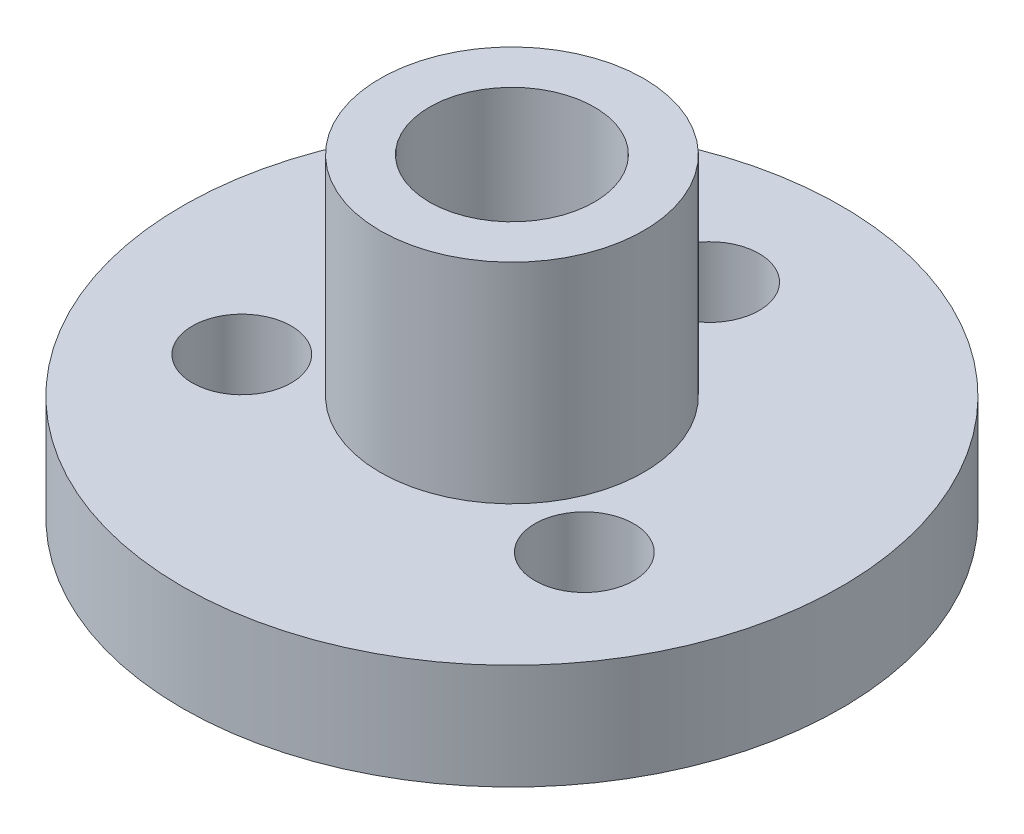
ISO-10303-21;
HEADER;
FILE_DESCRIPTION(('STEP AP214'),'2;1');
FILE_NAME('part.step','',(''),(''),'','','');
FILE_SCHEMA(('AUTOMOTIVE_DESIGN { 1 0 10303 214 1 1 1 1 }'));
ENDSEC;
DATA;
#1=APPLICATION_CONTEXT('core data for automotive mechanical design processes');
#2=APPLICATION_PROTOCOL_DEFINITION('international standard','automotive_design',2000,#1);
#3=PRODUCT_CONTEXT('',#1,'mechanical');
#4=PRODUCT('Part','Part','',(#3));
#5=PRODUCT_RELATED_PRODUCT_CATEGORY('part','',(#4));
#6=PRODUCT_DEFINITION_FORMATION('','',#4);
#7=PRODUCT_DEFINITION_CONTEXT('part definition',#1,'design');
#8=PRODUCT_DEFINITION('design','',#6,#7);
#9=PRODUCT_DEFINITION_SHAPE('','',#8);
#10=(LENGTH_UNIT() NAMED_UNIT(*) SI_UNIT(.MILLI.,.METRE.));
#11=(NAMED_UNIT(*) PLANE_ANGLE_UNIT() SI_UNIT($,.RADIAN.));
#12=(NAMED_UNIT(*) SI_UNIT($,.STERADIAN.) SOLID_ANGLE_UNIT());
#13=UNCERTAINTY_MEASURE_WITH_UNIT(LENGTH_MEASURE(1.E-05),#10,'distance_accuracy_value','');
#14=(GEOMETRIC_REPRESENTATION_CONTEXT(3) GLOBAL_UNCERTAINTY_ASSIGNED_CONTEXT((#13)) GLOBAL_UNIT_ASSIGNED_CONTEXT((#10,
#11,#12)) REPRESENTATION_CONTEXT('',''));
#15=CARTESIAN_POINT('',(0.,0.,0.));
#16=DIRECTION('',(0.,0.,1.));
#17=DIRECTION('',(1.,0.,0.));
#18=AXIS2_PLACEMENT_3D('',#15,#16,#17);
#19=CARTESIAN_POINT('',(-4.,9.55,0.));
#20=DIRECTION('',(0.,1.,0.));
#21=DIRECTION('',(0.,0.,1.));
#22=AXIS2_PLACEMENT_3D('',#19,#20,#21);
#23=PLANE('',#22);
#24=CARTESIAN_POINT('',(0.,9.55,0.));
#25=DIRECTION('',(0.,1.,0.));
#26=DIRECTION('',(0.,0.,1.));
#27=AXIS2_PLACEMENT_3D('',#24,#25,#26);
#28=CIRCLE('',#27,4.);
#29=CARTESIAN_POINT('',(0.,9.55,4.));
#30=VERTEX_POINT('',#29);
#31=EDGE_CURVE('E56',#30,#30,#28,.T.);
#32=ORIENTED_EDGE('',*,*,#31,.T.);
#33=EDGE_LOOP('',(#32));
#34=FACE_BOUND('',#33,.T.);
#35=CARTESIAN_POINT('',(0.,9.55,0.));
#36=DIRECTION('',(0.,1.,0.));
#37=DIRECTION('',(0.,0.,1.));
#38=AXIS2_PLACEMENT_3D('',#35,#36,#37);
#39=CIRCLE('',#38,2.5);
#40=CARTESIAN_POINT('',(0.,9.55,2.5));
#41=VERTEX_POINT('',#40);
#42=EDGE_CURVE('E10',#41,#41,#39,.T.);
#43=ORIENTED_EDGE('',*,*,#42,.F.);
#44=EDGE_LOOP('',(#43));
#45=FACE_BOUND('',#44,.T.);
#46=ADVANCED_FACE('F34',(#34,#45),#23,.T.);
#47=CARTESIAN_POINT('',(0.,12.5097739938105,0.));
#48=DIRECTION('',(0.,1.,0.));
#49=DIRECTION('',(0.,0.,1.));
#50=AXIS2_PLACEMENT_3D('',#47,#48,#49);
#51=CYLINDRICAL_SURFACE('',#50,2.5);
#52=ORIENTED_EDGE('',*,*,#42,.T.);
#53=EDGE_LOOP('',(#52));
#54=FACE_BOUND('',#53,.T.);
#55=CARTESIAN_POINT('',(0.,0.,0.));
#56=DIRECTION('',(0.,1.,0.));
#57=DIRECTION('',(0.,0.,1.));
#58=AXIS2_PLACEMENT_3D('',#55,#56,#57);
#59=CIRCLE('',#58,2.5);
#60=CARTESIAN_POINT('',(0.,0.,2.5));
#61=VERTEX_POINT('',#60);
#62=EDGE_CURVE('E40',#61,#61,#59,.T.);
#63=ORIENTED_EDGE('',*,*,#62,.F.);
#64=EDGE_LOOP('',(#63));
#65=FACE_BOUND('',#64,.T.);
#66=ADVANCED_FACE('F110',(#54,#65),#51,.F.);
#67=CARTESIAN_POINT('',(-2.5,0.,0.));
#68=DIRECTION('',(0.,-1.,0.));
#69=DIRECTION('',(0.,0.,-1.));
#70=AXIS2_PLACEMENT_3D('',#67,#68,#69);
#71=PLANE('',#70);
#72=CARTESIAN_POINT('',(0.,0.,-6.));
#73=DIRECTION('',(0.,1.,0.));
#74=DIRECTION('',(0.,0.,1.));
#75=AXIS2_PLACEMENT_3D('',#72,#73,#74);
#76=CIRCLE('',#75,1.5);
#77=CARTESIAN_POINT('',(0.,0.,-4.5));
#78=VERTEX_POINT('',#77);
#79=EDGE_CURVE('E59',#78,#78,#76,.T.);
#80=ORIENTED_EDGE('',*,*,#79,.T.);
#81=EDGE_LOOP('',(#80));
#82=FACE_BOUND('',#81,.T.);
#83=CARTESIAN_POINT('',(5.19615242270663,0.,3.));
#84=DIRECTION('',(0.,1.,0.));
#85=DIRECTION('',(0.,0.,1.));
#86=AXIS2_PLACEMENT_3D('',#83,#84,#85);
#87=CIRCLE('',#86,1.5);
#88=CARTESIAN_POINT('',(5.19615242270663,0.,4.5));
#89=VERTEX_POINT('',#88);
#90=EDGE_CURVE('E69',#89,#89,#87,.T.);
#91=ORIENTED_EDGE('',*,*,#90,.T.);
#92=EDGE_LOOP('',(#91));
#93=FACE_BOUND('',#92,.T.);
#94=CARTESIAN_POINT('',(-5.19615242270663,0.,3.));
#95=DIRECTION('',(0.,1.,0.));
#96=DIRECTION('',(0.,0.,1.));
#97=AXIS2_PLACEMENT_3D('',#94,#95,#96);
#98=CIRCLE('',#97,1.5);
#99=CARTESIAN_POINT('',(-5.19615242270663,0.,4.5));
#100=VERTEX_POINT('',#99);
#101=EDGE_CURVE('E63',#100,#100,#98,.T.);
#102=ORIENTED_EDGE('',*,*,#101,.T.);
#103=EDGE_LOOP('',(#102));
#104=FACE_BOUND('',#103,.T.);
#105=ORIENTED_EDGE('',*,*,#62,.T.);
#106=EDGE_LOOP('',(#105));
#107=FACE_BOUND('',#106,.T.);
#108=CARTESIAN_POINT('',(0.,0.,0.));
#109=DIRECTION('',(0.,1.,0.));
#110=DIRECTION('',(0.,0.,1.));
#111=AXIS2_PLACEMENT_3D('',#108,#109,#110);
#112=CIRCLE('',#111,10.);
#113=CARTESIAN_POINT('',(0.,0.,10.));
#114=VERTEX_POINT('',#113);
#115=EDGE_CURVE('E44',#114,#114,#112,.T.);
#116=ORIENTED_EDGE('',*,*,#115,.F.);
#117=EDGE_LOOP('',(#116));
#118=FACE_BOUND('',#117,.T.);
#119=ADVANCED_FACE('F78',(#82,#93,#104,#107,#118),#71,.T.);
#120=CARTESIAN_POINT('',(0.,12.5097739938105,0.));
#121=DIRECTION('',(0.,1.,0.));
#122=DIRECTION('',(0.,0.,1.));
#123=AXIS2_PLACEMENT_3D('',#120,#121,#122);
#124=CYLINDRICAL_SURFACE('',#123,10.);
#125=ORIENTED_EDGE('',*,*,#115,.T.);
#126=EDGE_LOOP('',(#125));
#127=FACE_BOUND('',#126,.T.);
#128=CARTESIAN_POINT('',(0.,3.2,0.));
#129=DIRECTION('',(0.,1.,0.));
#130=DIRECTION('',(0.,0.,1.));
#131=AXIS2_PLACEMENT_3D('',#128,#129,#130);
#132=CIRCLE('',#131,10.);
#133=CARTESIAN_POINT('',(0.,3.2,10.));
#134=VERTEX_POINT('',#133);
#135=EDGE_CURVE('E48',#134,#134,#132,.T.);
#136=ORIENTED_EDGE('',*,*,#135,.F.);
#137=EDGE_LOOP('',(#136));
#138=FACE_BOUND('',#137,.T.);
#139=ADVANCED_FACE('F92',(#127,#138),#124,.T.);
#140=CARTESIAN_POINT('',(-10.,3.2,0.));
#141=DIRECTION('',(0.,1.,0.));
#142=DIRECTION('',(0.,0.,1.));
#143=AXIS2_PLACEMENT_3D('',#140,#141,#142);
#144=PLANE('',#143);
#145=CARTESIAN_POINT('',(0.,3.2,-6.));
#146=DIRECTION('',(0.,1.,0.));
#147=DIRECTION('',(0.,0.,1.));
#148=AXIS2_PLACEMENT_3D('',#145,#146,#147);
#149=CIRCLE('',#148,1.5);
#150=CARTESIAN_POINT('',(0.,3.2,-4.5));
#151=VERTEX_POINT('',#150);
#152=EDGE_CURVE('E72',#151,#151,#149,.T.);
#153=ORIENTED_EDGE('',*,*,#152,.F.);
#154=EDGE_LOOP('',(#153));
#155=FACE_BOUND('',#154,.T.);
#156=CARTESIAN_POINT('',(5.19615242270663,3.2,3.));
#157=DIRECTION('',(0.,1.,0.));
#158=DIRECTION('',(0.,0.,1.));
#159=AXIS2_PLACEMENT_3D('',#156,#157,#158);
#160=CIRCLE('',#159,1.5);
#161=CARTESIAN_POINT('',(5.19615242270663,3.2,4.5));
#162=VERTEX_POINT('',#161);
#163=EDGE_CURVE('E66',#162,#162,#160,.T.);
#164=ORIENTED_EDGE('',*,*,#163,.F.);
#165=EDGE_LOOP('',(#164));
#166=FACE_BOUND('',#165,.T.);
#167=CARTESIAN_POINT('',(-5.19615242270663,3.2,3.));
#168=DIRECTION('',(0.,1.,0.));
#169=DIRECTION('',(0.,0.,1.));
#170=AXIS2_PLACEMENT_3D('',#167,#168,#169);
#171=CIRCLE('',#170,1.5);
#172=CARTESIAN_POINT('',(-5.19615242270663,3.2,4.5));
#173=VERTEX_POINT('',#172);
#174=EDGE_CURVE('E60',#173,#173,#171,.T.);
#175=ORIENTED_EDGE('',*,*,#174,.F.);
#176=EDGE_LOOP('',(#175));
#177=FACE_BOUND('',#176,.T.);
#178=ORIENTED_EDGE('',*,*,#135,.T.);
#179=EDGE_LOOP('',(#178));
#180=FACE_BOUND('',#179,.T.);
#181=CARTESIAN_POINT('',(0.,3.2,0.));
#182=DIRECTION('',(0.,1.,0.));
#183=DIRECTION('',(0.,0.,1.));
#184=AXIS2_PLACEMENT_3D('',#181,#182,#183);
#185=CIRCLE('',#184,4.);
#186=CARTESIAN_POINT('',(0.,3.2,4.));
#187=VERTEX_POINT('',#186);
#188=EDGE_CURVE('E53',#187,#187,#185,.T.);
#189=ORIENTED_EDGE('',*,*,#188,.F.);
#190=EDGE_LOOP('',(#189));
#191=FACE_BOUND('',#190,.T.);
#192=ADVANCED_FACE('F88',(#155,#166,#177,#180,#191),#144,.T.);
#193=CARTESIAN_POINT('',(0.,12.5097739938105,0.));
#194=DIRECTION('',(0.,1.,0.));
#195=DIRECTION('',(0.,0.,1.));
#196=AXIS2_PLACEMENT_3D('',#193,#194,#195);
#197=CYLINDRICAL_SURFACE('',#196,4.);
#198=ORIENTED_EDGE('',*,*,#188,.T.);
#199=EDGE_LOOP('',(#198));
#200=FACE_BOUND('',#199,.T.);
#201=ORIENTED_EDGE('',*,*,#31,.F.);
#202=EDGE_LOOP('',(#201));
#203=FACE_BOUND('',#202,.T.);
#204=ADVANCED_FACE('F91',(#200,#203),#197,.T.);
#205=CARTESIAN_POINT('',(-5.19615242270663,0.,3.));
#206=DIRECTION('',(0.,1.,0.));
#207=DIRECTION('',(0.,0.,1.));
#208=AXIS2_PLACEMENT_3D('',#205,#206,#207);
#209=CYLINDRICAL_SURFACE('',#208,1.5);
#210=CARTESIAN_POINT('',(-5.19615242270663,0.,4.5));
#211=CARTESIAN_POINT('',(-5.19615242270663,0.0333333333333333,4.5));
#212=CARTESIAN_POINT('',(-5.19615242270663,0.0666666666666666,4.5));
#213=CARTESIAN_POINT('',(-5.19615242270663,0.133333333333333,4.5));
#214=CARTESIAN_POINT('',(-5.19615242270663,0.166666666666667,4.5));
#215=CARTESIAN_POINT('',(-5.19615242270663,0.233333333333333,4.5));
#216=CARTESIAN_POINT('',(-5.19615242270663,0.266666666666667,4.5));
#217=CARTESIAN_POINT('',(-5.19615242270663,0.333333333333333,4.5));
#218=CARTESIAN_POINT('',(-5.19615242270663,0.366666666666667,4.5));
#219=CARTESIAN_POINT('',(-5.19615242270663,0.433333333333333,4.5));
#220=CARTESIAN_POINT('',(-5.19615242270663,0.466666666666667,4.5));
#221=CARTESIAN_POINT('',(-5.19615242270663,0.533333333333333,4.5));
#222=CARTESIAN_POINT('',(-5.19615242270663,0.566666666666667,4.5));
#223=CARTESIAN_POINT('',(-5.19615242270663,0.633333333333333,4.5));
#224=CARTESIAN_POINT('',(-5.19615242270663,0.666666666666666,4.5));
#225=CARTESIAN_POINT('',(-5.19615242270663,0.733333333333333,4.5));
#226=CARTESIAN_POINT('',(-5.19615242270663,0.766666666666666,4.5));
#227=CARTESIAN_POINT('',(-5.19615242270663,0.833333333333333,4.5));
#228=CARTESIAN_POINT('',(-5.19615242270663,0.866666666666666,4.5));
#229=CARTESIAN_POINT('',(-5.19615242270663,0.933333333333333,4.5));
#230=CARTESIAN_POINT('',(-5.19615242270663,0.966666666666666,4.5));
#231=CARTESIAN_POINT('',(-5.19615242270663,1.03333333333333,4.5));
#232=CARTESIAN_POINT('',(-5.19615242270663,1.06666666666667,4.5));
#233=CARTESIAN_POINT('',(-5.19615242270663,1.13333333333333,4.5));
#234=CARTESIAN_POINT('',(-5.19615242270663,1.16666666666667,4.5));
#235=CARTESIAN_POINT('',(-5.19615242270663,1.23333333333333,4.5));
#236=CARTESIAN_POINT('',(-5.19615242270663,1.26666666666667,4.5));
#237=CARTESIAN_POINT('',(-5.19615242270663,1.33333333333333,4.5));
#238=CARTESIAN_POINT('',(-5.19615242270663,1.36666666666667,4.5));
#239=CARTESIAN_POINT('',(-5.19615242270663,1.43333333333333,4.5));
#240=CARTESIAN_POINT('',(-5.19615242270663,1.46666666666667,4.5));
#241=CARTESIAN_POINT('',(-5.19615242270663,1.53333333333333,4.5));
#242=CARTESIAN_POINT('',(-5.19615242270663,1.56666666666667,4.5));
#243=CARTESIAN_POINT('',(-5.19615242270663,1.63333333333333,4.5));
#244=CARTESIAN_POINT('',(-5.19615242270663,1.66666666666667,4.5));
#245=CARTESIAN_POINT('',(-5.19615242270663,1.73333333333333,4.5));
#246=CARTESIAN_POINT('',(-5.19615242270663,1.76666666666667,4.5));
#247=CARTESIAN_POINT('',(-5.19615242270663,1.83333333333333,4.5));
#248=CARTESIAN_POINT('',(-5.19615242270663,1.86666666666667,4.5));
#249=CARTESIAN_POINT('',(-5.19615242270663,1.93333333333333,4.5));
#250=CARTESIAN_POINT('',(-5.19615242270663,1.96666666666667,4.5));
#251=CARTESIAN_POINT('',(-5.19615242270663,2.03333333333333,4.5));
#252=CARTESIAN_POINT('',(-5.19615242270663,2.06666666666667,4.5));
#253=CARTESIAN_POINT('',(-5.19615242270663,2.13333333333333,4.5));
#254=CARTESIAN_POINT('',(-5.19615242270663,2.16666666666667,4.5));
#255=CARTESIAN_POINT('',(-5.19615242270663,2.23333333333333,4.5));
#256=CARTESIAN_POINT('',(-5.19615242270663,2.26666666666667,4.5));
#257=CARTESIAN_POINT('',(-5.19615242270663,2.33333333333333,4.5));
#258=CARTESIAN_POINT('',(-5.19615242270663,2.36666666666667,4.5));
#259=CARTESIAN_POINT('',(-5.19615242270663,2.43333333333333,4.5));
#260=CARTESIAN_POINT('',(-5.19615242270663,2.46666666666667,4.5));
#261=CARTESIAN_POINT('',(-5.19615242270663,2.53333333333333,4.5));
#262=CARTESIAN_POINT('',(-5.19615242270663,2.56666666666667,4.5));
#263=CARTESIAN_POINT('',(-5.19615242270663,2.63333333333333,4.5));
#264=CARTESIAN_POINT('',(-5.19615242270663,2.66666666666667,4.5));
#265=CARTESIAN_POINT('',(-5.19615242270663,2.73333333333333,4.5));
#266=CARTESIAN_POINT('',(-5.19615242270663,2.76666666666667,4.5));
#267=CARTESIAN_POINT('',(-5.19615242270663,2.83333333333333,4.5));
#268=CARTESIAN_POINT('',(-5.19615242270663,2.86666666666667,4.5));
#269=CARTESIAN_POINT('',(-5.19615242270663,2.93333333333333,4.5));
#270=CARTESIAN_POINT('',(-5.19615242270663,2.96666666666667,4.5));
#271=CARTESIAN_POINT('',(-5.19615242270663,3.03333333333333,4.5));
#272=CARTESIAN_POINT('',(-5.19615242270663,3.06666666666667,4.5));
#273=CARTESIAN_POINT('',(-5.19615242270663,3.13333333333333,4.5));
#274=CARTESIAN_POINT('',(-5.19615242270663,3.16666666666667,4.5));
#275=CARTESIAN_POINT('',(-5.19615242270663,3.2,4.5));
#276=B_SPLINE_CURVE_WITH_KNOTS('',3,(#210,#211,#212,#213,#214,#215,#216,#217,#218,#219,#220,
#221,#222,#223,#224,#225,#226,#227,#228,#229,#230,#231,#232,#233,#234,#235,#236,#237,#238,#239,
#240,#241,#242,#243,#244,#245,#246,#247,#248,#249,#250,#251,#252,#253,#254,#255,#256,#257,#258,
#259,#260,#261,#262,#263,#264,#265,#266,#267,#268,#269,#270,#271,#272,#273,#274,#275),
.UNSPECIFIED.,.F.,.F.,(4,2,2,2,2,2,2,2,2,2,2,2,2,2,2,2,2,2,2,2,2,2,2,2,2,2,2,2,2,2,2,2,4),(0.,
0.1,0.2,0.3,0.4,0.5,0.6,0.7,0.8,0.9,1.,1.1,1.2,1.3,1.4,1.5,1.6,1.7,1.8,1.9,2.,2.1,2.2,2.3,2.4,
2.5,2.6,2.7,2.8,2.9,3.,3.1,3.2),.UNSPECIFIED.);
#277=EDGE_CURVE('BSEAM104',#100,#173,#276,.T.);
#278=ORIENTED_EDGE('',*,*,#101,.F.);
#279=ORIENTED_EDGE('',*,*,#174,.T.);
#280=ORIENTED_EDGE('',*,*,#277,.T.);
#281=ORIENTED_EDGE('',*,*,#277,.F.);
#282=EDGE_LOOP('',(#278,#280,#279,#281));
#283=FACE_BOUND('',#282,.T.);
#284=ADVANCED_FACE('F104',(#283),#209,.F.);
#285=CARTESIAN_POINT('',(5.19615242270663,0.,3.));
#286=DIRECTION('',(0.,1.,0.));
#287=DIRECTION('',(0.,0.,1.));
#288=AXIS2_PLACEMENT_3D('',#285,#286,#287);
#289=CYLINDRICAL_SURFACE('',#288,1.5);
#290=CARTESIAN_POINT('',(5.19615242270663,0.,4.5));
#291=CARTESIAN_POINT('',(5.19615242270663,0.0333333333333333,4.5));
#292=CARTESIAN_POINT('',(5.19615242270663,0.0666666666666666,4.5));
#293=CARTESIAN_POINT('',(5.19615242270663,0.133333333333333,4.5));
#294=CARTESIAN_POINT('',(5.19615242270663,0.166666666666667,4.5));
#295=CARTESIAN_POINT('',(5.19615242270663,0.233333333333333,4.5));
#296=CARTESIAN_POINT('',(5.19615242270663,0.266666666666667,4.5));
#297=CARTESIAN_POINT('',(5.19615242270663,0.333333333333333,4.5));
#298=CARTESIAN_POINT('',(5.19615242270663,0.366666666666667,4.5));
#299=CARTESIAN_POINT('',(5.19615242270663,0.433333333333333,4.5));
#300=CARTESIAN_POINT('',(5.19615242270663,0.466666666666667,4.5));
#301=CARTESIAN_POINT('',(5.19615242270663,0.533333333333333,4.5));
#302=CARTESIAN_POINT('',(5.19615242270663,0.566666666666667,4.5));
#303=CARTESIAN_POINT('',(5.19615242270663,0.633333333333333,4.5));
#304=CARTESIAN_POINT('',(5.19615242270663,0.666666666666666,4.5));
#305=CARTESIAN_POINT('',(5.19615242270663,0.733333333333333,4.5));
#306=CARTESIAN_POINT('',(5.19615242270663,0.766666666666666,4.5));
#307=CARTESIAN_POINT('',(5.19615242270663,0.833333333333333,4.5));
#308=CARTESIAN_POINT('',(5.19615242270663,0.866666666666666,4.5));
#309=CARTESIAN_POINT('',(5.19615242270663,0.933333333333333,4.5));
#310=CARTESIAN_POINT('',(5.19615242270663,0.966666666666666,4.5));
#311=CARTESIAN_POINT('',(5.19615242270663,1.03333333333333,4.5));
#312=CARTESIAN_POINT('',(5.19615242270663,1.06666666666667,4.5));
#313=CARTESIAN_POINT('',(5.19615242270663,1.13333333333333,4.5));
#314=CARTESIAN_POINT('',(5.19615242270663,1.16666666666667,4.5));
#315=CARTESIAN_POINT('',(5.19615242270663,1.23333333333333,4.5));
#316=CARTESIAN_POINT('',(5.19615242270663,1.26666666666667,4.5));
#317=CARTESIAN_POINT('',(5.19615242270663,1.33333333333333,4.5));
#318=CARTESIAN_POINT('',(5.19615242270663,1.36666666666667,4.5));
#319=CARTESIAN_POINT('',(5.19615242270663,1.43333333333333,4.5));
#320=CARTESIAN_POINT('',(5.19615242270663,1.46666666666667,4.5));
#321=CARTESIAN_POINT('',(5.19615242270663,1.53333333333333,4.5));
#322=CARTESIAN_POINT('',(5.19615242270663,1.56666666666667,4.5));
#323=CARTESIAN_POINT('',(5.19615242270663,1.63333333333333,4.5));
#324=CARTESIAN_POINT('',(5.19615242270663,1.66666666666667,4.5));
#325=CARTESIAN_POINT('',(5.19615242270663,1.73333333333333,4.5));
#326=CARTESIAN_POINT('',(5.19615242270663,1.76666666666667,4.5));
#327=CARTESIAN_POINT('',(5.19615242270663,1.83333333333333,4.5));
#328=CARTESIAN_POINT('',(5.19615242270663,1.86666666666667,4.5));
#329=CARTESIAN_POINT('',(5.19615242270663,1.93333333333333,4.5));
#330=CARTESIAN_POINT('',(5.19615242270663,1.96666666666667,4.5));
#331=CARTESIAN_POINT('',(5.19615242270663,2.03333333333333,4.5));
#332=CARTESIAN_POINT('',(5.19615242270663,2.06666666666667,4.5));
#333=CARTESIAN_POINT('',(5.19615242270663,2.13333333333333,4.5));
#334=CARTESIAN_POINT('',(5.19615242270663,2.16666666666667,4.5));
#335=CARTESIAN_POINT('',(5.19615242270663,2.23333333333333,4.5));
#336=CARTESIAN_POINT('',(5.19615242270663,2.26666666666667,4.5));
#337=CARTESIAN_POINT('',(5.19615242270663,2.33333333333333,4.5));
#338=CARTESIAN_POINT('',(5.19615242270663,2.36666666666667,4.5));
#339=CARTESIAN_POINT('',(5.19615242270663,2.43333333333333,4.5));
#340=CARTESIAN_POINT('',(5.19615242270663,2.46666666666667,4.5));
#341=CARTESIAN_POINT('',(5.19615242270663,2.53333333333333,4.5));
#342=CARTESIAN_POINT('',(5.19615242270663,2.56666666666667,4.5));
#343=CARTESIAN_POINT('',(5.19615242270663,2.63333333333333,4.5));
#344=CARTESIAN_POINT('',(5.19615242270663,2.66666666666667,4.5));
#345=CARTESIAN_POINT('',(5.19615242270663,2.73333333333333,4.5));
#346=CARTESIAN_POINT('',(5.19615242270663,2.76666666666667,4.5));
#347=CARTESIAN_POINT('',(5.19615242270663,2.83333333333333,4.5));
#348=CARTESIAN_POINT('',(5.19615242270663,2.86666666666667,4.5));
#349=CARTESIAN_POINT('',(5.19615242270663,2.93333333333333,4.5));
#350=CARTESIAN_POINT('',(5.19615242270663,2.96666666666667,4.5));
#351=CARTESIAN_POINT('',(5.19615242270663,3.03333333333333,4.5));
#352=CARTESIAN_POINT('',(5.19615242270663,3.06666666666667,4.5));
#353=CARTESIAN_POINT('',(5.19615242270663,3.13333333333333,4.5));
#354=CARTESIAN_POINT('',(5.19615242270663,3.16666666666667,4.5));
#355=CARTESIAN_POINT('',(5.19615242270663,3.2,4.5));
#356=B_SPLINE_CURVE_WITH_KNOTS('',3,(#290,#291,#292,#293,#294,#295,#296,#297,#298,#299,#300,
#301,#302,#303,#304,#305,#306,#307,#308,#309,#310,#311,#312,#313,#314,#315,#316,#317,#318,#319,
#320,#321,#322,#323,#324,#325,#326,#327,#328,#329,#330,#331,#332,#333,#334,#335,#336,#337,#338,
#339,#340,#341,#342,#343,#344,#345,#346,#347,#348,#349,#350,#351,#352,#353,#354,#355),
.UNSPECIFIED.,.F.,.F.,(4,2,2,2,2,2,2,2,2,2,2,2,2,2,2,2,2,2,2,2,2,2,2,2,2,2,2,2,2,2,2,2,4),(0.,
0.1,0.2,0.3,0.4,0.5,0.6,0.7,0.8,0.9,1.,1.1,1.2,1.3,1.4,1.5,1.6,1.7,1.8,1.9,2.,2.1,2.2,2.3,2.4,
2.5,2.6,2.7,2.8,2.9,3.,3.1,3.2),.UNSPECIFIED.);
#357=EDGE_CURVE('BSEAM84',#89,#162,#356,.T.);
#358=ORIENTED_EDGE('',*,*,#90,.F.);
#359=ORIENTED_EDGE('',*,*,#163,.T.);
#360=ORIENTED_EDGE('',*,*,#357,.T.);
#361=ORIENTED_EDGE('',*,*,#357,.F.);
#362=EDGE_LOOP('',(#358,#360,#359,#361));
#363=FACE_BOUND('',#362,.T.);
#364=ADVANCED_FACE('F84',(#363),#289,.F.);
#365=CARTESIAN_POINT('',(0.,0.,-6.));
#366=DIRECTION('',(0.,1.,0.));
#367=DIRECTION('',(0.,0.,1.));
#368=AXIS2_PLACEMENT_3D('',#365,#366,#367);
#369=CYLINDRICAL_SURFACE('',#368,1.5);
#370=CARTESIAN_POINT('',(0.,0.,-4.5));
#371=CARTESIAN_POINT('',(0.,0.0333333333333333,-4.5));
#372=CARTESIAN_POINT('',(0.,0.0666666666666666,-4.5));
#373=CARTESIAN_POINT('',(0.,0.133333333333333,-4.5));
#374=CARTESIAN_POINT('',(0.,0.166666666666667,-4.5));
#375=CARTESIAN_POINT('',(0.,0.233333333333333,-4.5));
#376=CARTESIAN_POINT('',(0.,0.266666666666667,-4.5));
#377=CARTESIAN_POINT('',(0.,0.333333333333333,-4.5));
#378=CARTESIAN_POINT('',(0.,0.366666666666667,-4.5));
#379=CARTESIAN_POINT('',(0.,0.433333333333333,-4.5));
#380=CARTESIAN_POINT('',(0.,0.466666666666667,-4.5));
#381=CARTESIAN_POINT('',(0.,0.533333333333333,-4.5));
#382=CARTESIAN_POINT('',(0.,0.566666666666667,-4.5));
#383=CARTESIAN_POINT('',(0.,0.633333333333333,-4.5));
#384=CARTESIAN_POINT('',(0.,0.666666666666666,-4.5));
#385=CARTESIAN_POINT('',(0.,0.733333333333333,-4.5));
#386=CARTESIAN_POINT('',(0.,0.766666666666666,-4.5));
#387=CARTESIAN_POINT('',(0.,0.833333333333333,-4.5));
#388=CARTESIAN_POINT('',(0.,0.866666666666666,-4.5));
#389=CARTESIAN_POINT('',(0.,0.933333333333333,-4.5));
#390=CARTESIAN_POINT('',(0.,0.966666666666666,-4.5));
#391=CARTESIAN_POINT('',(0.,1.03333333333333,-4.5));
#392=CARTESIAN_POINT('',(0.,1.06666666666667,-4.5));
#393=CARTESIAN_POINT('',(0.,1.13333333333333,-4.5));
#394=CARTESIAN_POINT('',(0.,1.16666666666667,-4.5));
#395=CARTESIAN_POINT('',(0.,1.23333333333333,-4.5));
#396=CARTESIAN_POINT('',(0.,1.26666666666667,-4.5));
#397=CARTESIAN_POINT('',(0.,1.33333333333333,-4.5));
#398=CARTESIAN_POINT('',(0.,1.36666666666667,-4.5));
#399=CARTESIAN_POINT('',(0.,1.43333333333333,-4.5));
#400=CARTESIAN_POINT('',(0.,1.46666666666667,-4.5));
#401=CARTESIAN_POINT('',(0.,1.53333333333333,-4.5));
#402=CARTESIAN_POINT('',(0.,1.56666666666667,-4.5));
#403=CARTESIAN_POINT('',(0.,1.63333333333333,-4.5));
#404=CARTESIAN_POINT('',(0.,1.66666666666667,-4.5));
#405=CARTESIAN_POINT('',(0.,1.73333333333333,-4.5));
#406=CARTESIAN_POINT('',(0.,1.76666666666667,-4.5));
#407=CARTESIAN_POINT('',(0.,1.83333333333333,-4.5));
#408=CARTESIAN_POINT('',(0.,1.86666666666667,-4.5));
#409=CARTESIAN_POINT('',(0.,1.93333333333333,-4.5));
#410=CARTESIAN_POINT('',(0.,1.96666666666667,-4.5));
#411=CARTESIAN_POINT('',(0.,2.03333333333333,-4.5));
#412=CARTESIAN_POINT('',(0.,2.06666666666667,-4.5));
#413=CARTESIAN_POINT('',(0.,2.13333333333333,-4.5));
#414=CARTESIAN_POINT('',(0.,2.16666666666667,-4.5));
#415=CARTESIAN_POINT('',(0.,2.23333333333333,-4.5));
#416=CARTESIAN_POINT('',(0.,2.26666666666667,-4.5));
#417=CARTESIAN_POINT('',(0.,2.33333333333333,-4.5));
#418=CARTESIAN_POINT('',(0.,2.36666666666667,-4.5));
#419=CARTESIAN_POINT('',(0.,2.43333333333333,-4.5));
#420=CARTESIAN_POINT('',(0.,2.46666666666667,-4.5));
#421=CARTESIAN_POINT('',(0.,2.53333333333333,-4.5));
#422=CARTESIAN_POINT('',(0.,2.56666666666667,-4.5));
#423=CARTESIAN_POINT('',(0.,2.63333333333333,-4.5));
#424=CARTESIAN_POINT('',(0.,2.66666666666667,-4.5));
#425=CARTESIAN_POINT('',(0.,2.73333333333333,-4.5));
#426=CARTESIAN_POINT('',(0.,2.76666666666667,-4.5));
#427=CARTESIAN_POINT('',(0.,2.83333333333333,-4.5));
#428=CARTESIAN_POINT('',(0.,2.86666666666667,-4.5));
#429=CARTESIAN_POINT('',(0.,2.93333333333333,-4.5));
#430=CARTESIAN_POINT('',(0.,2.96666666666667,-4.5));
#431=CARTESIAN_POINT('',(0.,3.03333333333333,-4.5));
#432=CARTESIAN_POINT('',(0.,3.06666666666667,-4.5));
#433=CARTESIAN_POINT('',(0.,3.13333333333333,-4.5));
#434=CARTESIAN_POINT('',(0.,3.16666666666667,-4.5));
#435=CARTESIAN_POINT('',(0.,3.2,-4.5));
#436=B_SPLINE_CURVE_WITH_KNOTS('',3,(#370,#371,#372,#373,#374,#375,#376,#377,#378,#379,#380,
#381,#382,#383,#384,#385,#386,#387,#388,#389,#390,#391,#392,#393,#394,#395,#396,#397,#398,#399,
#400,#401,#402,#403,#404,#405,#406,#407,#408,#409,#410,#411,#412,#413,#414,#415,#416,#417,#418,
#419,#420,#421,#422,#423,#424,#425,#426,#427,#428,#429,#430,#431,#432,#433,#434,#435),
.UNSPECIFIED.,.F.,.F.,(4,2,2,2,2,2,2,2,2,2,2,2,2,2,2,2,2,2,2,2,2,2,2,2,2,2,2,2,2,2,2,2,4),(0.,
0.1,0.2,0.3,0.4,0.5,0.6,0.7,0.8,0.9,1.,1.1,1.2,1.3,1.4,1.5,1.6,1.7,1.8,1.9,2.,2.1,2.2,2.3,2.4,
2.5,2.6,2.7,2.8,2.9,3.,3.1,3.2),.UNSPECIFIED.);
#437=EDGE_CURVE('BSEAM81',#78,#151,#436,.T.);
#438=ORIENTED_EDGE('',*,*,#79,.F.);
#439=ORIENTED_EDGE('',*,*,#152,.T.);
#440=ORIENTED_EDGE('',*,*,#437,.T.);
#441=ORIENTED_EDGE('',*,*,#437,.F.);
#442=EDGE_LOOP('',(#438,#440,#439,#441));
#443=FACE_BOUND('',#442,.T.);
#444=ADVANCED_FACE('F81',(#443),#369,.F.);
#445=CLOSED_SHELL('',(#46,#66,#119,#139,#192,#204,#284,#364,#444));
#446=MANIFOLD_SOLID_BREP('B2',#445);
#447=ADVANCED_BREP_SHAPE_REPRESENTATION('',(#18,#446),#14);
#448=SHAPE_DEFINITION_REPRESENTATION(#9,#447);
ENDSEC;
END-ISO-10303-21;
